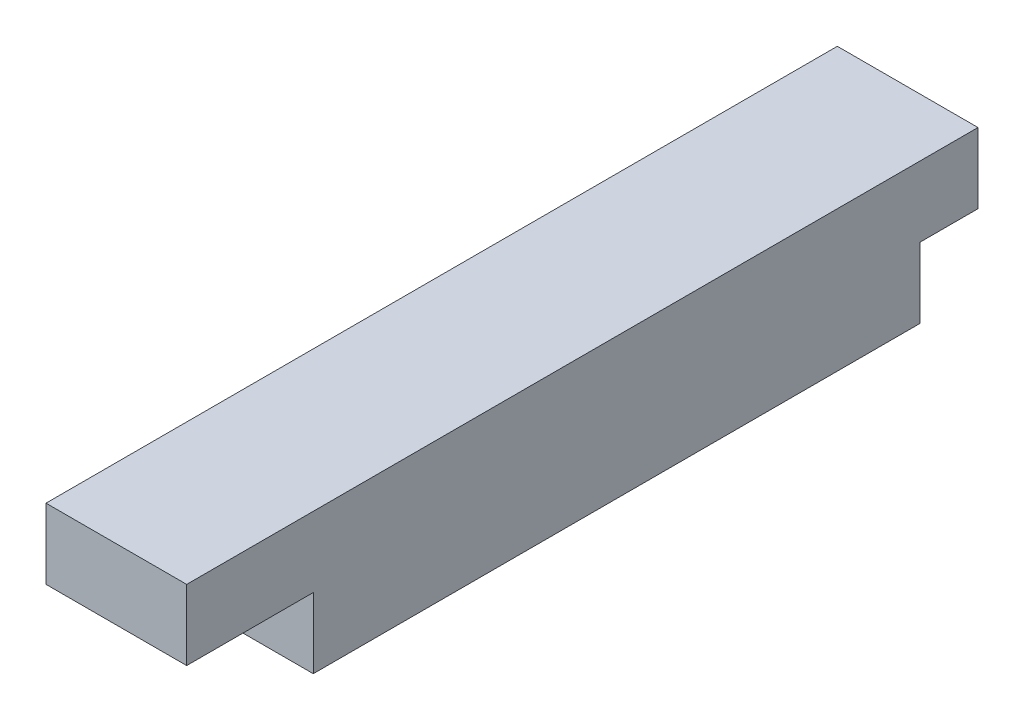
ISO-10303-21;
HEADER;
FILE_DESCRIPTION(('STEP AP214'),'2;1');
FILE_NAME('part.step','',(''),(''),'','','');
FILE_SCHEMA(('AUTOMOTIVE_DESIGN { 1 0 10303 214 1 1 1 1 }'));
ENDSEC;
DATA;
#1=APPLICATION_CONTEXT('core data for automotive mechanical design processes');
#2=APPLICATION_PROTOCOL_DEFINITION('international standard','automotive_design',2000,#1);
#3=PRODUCT_CONTEXT('',#1,'mechanical');
#4=PRODUCT('Part','Part','',(#3));
#5=PRODUCT_RELATED_PRODUCT_CATEGORY('part','',(#4));
#6=PRODUCT_DEFINITION_FORMATION('','',#4);
#7=PRODUCT_DEFINITION_CONTEXT('part definition',#1,'design');
#8=PRODUCT_DEFINITION('design','',#6,#7);
#9=PRODUCT_DEFINITION_SHAPE('','',#8);
#10=(LENGTH_UNIT() NAMED_UNIT(*) SI_UNIT(.MILLI.,.METRE.));
#11=(NAMED_UNIT(*) PLANE_ANGLE_UNIT() SI_UNIT($,.RADIAN.));
#12=(NAMED_UNIT(*) SI_UNIT($,.STERADIAN.) SOLID_ANGLE_UNIT());
#13=UNCERTAINTY_MEASURE_WITH_UNIT(LENGTH_MEASURE(1.E-05),#10,'distance_accuracy_value','');
#14=(GEOMETRIC_REPRESENTATION_CONTEXT(3) GLOBAL_UNCERTAINTY_ASSIGNED_CONTEXT((#13)) GLOBAL_UNIT_ASSIGNED_CONTEXT((#10,
#11,#12)) REPRESENTATION_CONTEXT('',''));
#15=CARTESIAN_POINT('',(0.,0.,0.));
#16=DIRECTION('',(0.,0.,1.));
#17=DIRECTION('',(1.,0.,0.));
#18=AXIS2_PLACEMENT_3D('',#15,#16,#17);
#19=CARTESIAN_POINT('',(0.,4.,0.));
#20=DIRECTION('',(1.,0.,0.));
#21=DIRECTION('',(0.,0.,-1.));
#22=AXIS2_PLACEMENT_3D('',#19,#20,#21);
#23=PLANE('',#22);
#24=DIRECTION('',(0.,0.,1.));
#25=VECTOR('',#24,1.);
#26=CARTESIAN_POINT('',(0.,0.,0.));
#27=LINE('',#26,#25);
#28=CARTESIAN_POINT('',(0.,0.,-45.));
#29=VERTEX_POINT('',#28);
#30=CARTESIAN_POINT('',(0.,0.,0.));
#31=VERTEX_POINT('',#30);
#32=EDGE_CURVE('E125',#29,#31,#27,.T.);
#33=ORIENTED_EDGE('',*,*,#32,.T.);
#34=DIRECTION('',(0.,-1.,0.));
#35=VECTOR('',#34,1.);
#36=CARTESIAN_POINT('',(0.,4.,0.));
#37=LINE('',#36,#35);
#38=CARTESIAN_POINT('',(0.,4.,0.));
#39=VERTEX_POINT('',#38);
#40=EDGE_CURVE('E11',#39,#31,#37,.T.);
#41=ORIENTED_EDGE('',*,*,#40,.F.);
#42=DIRECTION('',(0.,0.,1.));
#43=VECTOR('',#42,1.);
#44=CARTESIAN_POINT('',(0.,4.,0.));
#45=LINE('',#44,#43);
#46=CARTESIAN_POINT('',(0.,4.,-45.));
#47=VERTEX_POINT('',#46);
#48=EDGE_CURVE('E147',#47,#39,#45,.T.);
#49=ORIENTED_EDGE('',*,*,#48,.F.);
#50=DIRECTION('',(0.,-1.,0.));
#51=VECTOR('',#50,1.);
#52=CARTESIAN_POINT('',(0.,4.,-45.));
#53=LINE('',#52,#51);
#54=EDGE_CURVE('E156',#47,#29,#53,.T.);
#55=ORIENTED_EDGE('',*,*,#54,.T.);
#56=EDGE_LOOP('',(#33,#41,#49,#55));
#57=FACE_BOUND('',#56,.T.);
#58=ADVANCED_FACE('F35',(#57),#23,.F.);
#59=CARTESIAN_POINT('',(0.,4.,0.));
#60=DIRECTION('',(0.,0.,-1.));
#61=DIRECTION('',(-1.,0.,0.));
#62=AXIS2_PLACEMENT_3D('',#59,#60,#61);
#63=PLANE('',#62);
#64=DIRECTION('',(1.,0.,0.));
#65=VECTOR('',#64,1.);
#66=CARTESIAN_POINT('',(0.,0.,0.));
#67=LINE('',#66,#65);
#68=CARTESIAN_POINT('',(8.,0.,0.));
#69=VERTEX_POINT('',#68);
#70=EDGE_CURVE('E128',#31,#69,#67,.T.);
#71=ORIENTED_EDGE('',*,*,#70,.T.);
#72=DIRECTION('',(0.,-1.,0.));
#73=VECTOR('',#72,1.);
#74=CARTESIAN_POINT('',(8.,4.,0.));
#75=LINE('',#74,#73);
#76=CARTESIAN_POINT('',(8.,4.,0.));
#77=VERTEX_POINT('',#76);
#78=EDGE_CURVE('E43',#77,#69,#75,.T.);
#79=ORIENTED_EDGE('',*,*,#78,.F.);
#80=DIRECTION('',(1.,0.,0.));
#81=VECTOR('',#80,1.);
#82=CARTESIAN_POINT('',(0.,4.,0.));
#83=LINE('',#82,#81);
#84=EDGE_CURVE('E150',#39,#77,#83,.T.);
#85=ORIENTED_EDGE('',*,*,#84,.F.);
#86=ORIENTED_EDGE('',*,*,#40,.T.);
#87=EDGE_LOOP('',(#71,#79,#85,#86));
#88=FACE_BOUND('',#87,.T.);
#89=ADVANCED_FACE('F180',(#88),#63,.F.);
#90=CARTESIAN_POINT('',(8.,4.,0.));
#91=DIRECTION('',(-1.,0.,0.));
#92=DIRECTION('',(0.,0.,1.));
#93=AXIS2_PLACEMENT_3D('',#90,#91,#92);
#94=PLANE('',#93);
#95=DIRECTION('',(0.,0.,-1.));
#96=VECTOR('',#95,1.);
#97=CARTESIAN_POINT('',(8.,0.,0.));
#98=LINE('',#97,#96);
#99=CARTESIAN_POINT('',(8.,0.,-7.2));
#100=VERTEX_POINT('',#99);
#101=EDGE_CURVE('E124',#69,#100,#98,.T.);
#102=ORIENTED_EDGE('',*,*,#101,.T.);
#103=DIRECTION('',(0.,1.,0.));
#104=VECTOR('',#103,1.);
#105=CARTESIAN_POINT('',(8.,-4.,-7.2));
#106=LINE('',#105,#104);
#107=CARTESIAN_POINT('',(8.,-4.,-7.2));
#108=VERTEX_POINT('',#107);
#109=EDGE_CURVE('E104',#108,#100,#106,.T.);
#110=ORIENTED_EDGE('',*,*,#109,.F.);
#111=DIRECTION('',(0.,0.,1.));
#112=VECTOR('',#111,1.);
#113=CARTESIAN_POINT('',(8.,-4.,-41.7));
#114=LINE('',#113,#112);
#115=CARTESIAN_POINT('',(8.,-4.,-41.7));
#116=VERTEX_POINT('',#115);
#117=EDGE_CURVE('E110',#116,#108,#114,.T.);
#118=ORIENTED_EDGE('',*,*,#117,.F.);
#119=DIRECTION('',(0.,1.,0.));
#120=VECTOR('',#119,1.);
#121=CARTESIAN_POINT('',(8.,-4.,-41.7));
#122=LINE('',#121,#120);
#123=CARTESIAN_POINT('',(8.,0.,-41.7));
#124=VERTEX_POINT('',#123);
#125=EDGE_CURVE('E140',#116,#124,#122,.T.);
#126=ORIENTED_EDGE('',*,*,#125,.T.);
#127=CARTESIAN_POINT('',(8.,0.,-45.));
#128=VERTEX_POINT('',#127);
#129=EDGE_CURVE('E56',#124,#128,#98,.T.);
#130=ORIENTED_EDGE('',*,*,#129,.T.);
#131=DIRECTION('',(0.,-1.,0.));
#132=VECTOR('',#131,1.);
#133=CARTESIAN_POINT('',(8.,4.,-45.));
#134=LINE('',#133,#132);
#135=CARTESIAN_POINT('',(8.,4.,-45.));
#136=VERTEX_POINT('',#135);
#137=EDGE_CURVE('E167',#136,#128,#134,.T.);
#138=ORIENTED_EDGE('',*,*,#137,.F.);
#139=DIRECTION('',(0.,0.,-1.));
#140=VECTOR('',#139,1.);
#141=CARTESIAN_POINT('',(8.,4.,0.));
#142=LINE('',#141,#140);
#143=EDGE_CURVE('E153',#77,#136,#142,.T.);
#144=ORIENTED_EDGE('',*,*,#143,.F.);
#145=ORIENTED_EDGE('',*,*,#78,.T.);
#146=EDGE_LOOP('',(#102,#110,#118,#126,#130,#138,#144,#145));
#147=FACE_BOUND('',#146,.T.);
#148=ADVANCED_FACE('F121',(#147),#94,.F.);
#149=CARTESIAN_POINT('',(0.,4.,-45.));
#150=DIRECTION('',(0.,0.,1.));
#151=DIRECTION('',(1.,0.,0.));
#152=AXIS2_PLACEMENT_3D('',#149,#150,#151);
#153=PLANE('',#152);
#154=DIRECTION('',(-1.,0.,0.));
#155=VECTOR('',#154,1.);
#156=CARTESIAN_POINT('',(0.,0.,-45.));
#157=LINE('',#156,#155);
#158=EDGE_CURVE('E151',#128,#29,#157,.T.);
#159=ORIENTED_EDGE('',*,*,#158,.T.);
#160=ORIENTED_EDGE('',*,*,#54,.F.);
#161=DIRECTION('',(-1.,0.,0.));
#162=VECTOR('',#161,1.);
#163=CARTESIAN_POINT('',(0.,4.,-45.));
#164=LINE('',#163,#162);
#165=EDGE_CURVE('E155',#136,#47,#164,.T.);
#166=ORIENTED_EDGE('',*,*,#165,.F.);
#167=ORIENTED_EDGE('',*,*,#137,.T.);
#168=EDGE_LOOP('',(#159,#160,#166,#167));
#169=FACE_BOUND('',#168,.T.);
#170=ADVANCED_FACE('F185',(#169),#153,.F.);
#171=CARTESIAN_POINT('',(0.,4.,0.));
#172=DIRECTION('',(0.,-1.,0.));
#173=DIRECTION('',(0.,0.,-1.));
#174=AXIS2_PLACEMENT_3D('',#171,#172,#173);
#175=PLANE('',#174);
#176=ORIENTED_EDGE('',*,*,#48,.T.);
#177=ORIENTED_EDGE('',*,*,#84,.T.);
#178=ORIENTED_EDGE('',*,*,#143,.T.);
#179=ORIENTED_EDGE('',*,*,#165,.T.);
#180=EDGE_LOOP('',(#176,#177,#178,#179));
#181=FACE_BOUND('',#180,.T.);
#182=ADVANCED_FACE('F183',(#181),#175,.F.);
#183=CARTESIAN_POINT('',(0.,0.,0.));
#184=DIRECTION('',(0.,-1.,0.));
#185=DIRECTION('',(0.,0.,-1.));
#186=AXIS2_PLACEMENT_3D('',#183,#184,#185);
#187=PLANE('',#186);
#188=DIRECTION('',(1.,0.,0.));
#189=VECTOR('',#188,1.);
#190=CARTESIAN_POINT('',(8.,0.,-41.7));
#191=LINE('',#190,#189);
#192=CARTESIAN_POINT('',(3.,0.,-41.7));
#193=VERTEX_POINT('',#192);
#194=EDGE_CURVE('E51',#193,#124,#191,.T.);
#195=ORIENTED_EDGE('',*,*,#194,.F.);
#196=DIRECTION('',(0.,0.,-1.));
#197=VECTOR('',#196,1.);
#198=CARTESIAN_POINT('',(3.,0.,-41.7));
#199=LINE('',#198,#197);
#200=CARTESIAN_POINT('',(3.,0.,-7.2));
#201=VERTEX_POINT('',#200);
#202=EDGE_CURVE('E139',#201,#193,#199,.T.);
#203=ORIENTED_EDGE('',*,*,#202,.F.);
#204=DIRECTION('',(-1.,0.,0.));
#205=VECTOR('',#204,1.);
#206=CARTESIAN_POINT('',(8.,0.,-7.2));
#207=LINE('',#206,#205);
#208=EDGE_CURVE('E273',#100,#201,#207,.T.);
#209=ORIENTED_EDGE('',*,*,#208,.F.);
#210=ORIENTED_EDGE('',*,*,#101,.F.);
#211=ORIENTED_EDGE('',*,*,#70,.F.);
#212=ORIENTED_EDGE('',*,*,#32,.F.);
#213=ORIENTED_EDGE('',*,*,#158,.F.);
#214=ORIENTED_EDGE('',*,*,#129,.F.);
#215=EDGE_LOOP('',(#195,#203,#209,#210,#211,#212,#213,#214));
#216=FACE_BOUND('',#215,.T.);
#217=ADVANCED_FACE('F177',(#216),#187,.T.);
#218=CARTESIAN_POINT('',(8.,-4.,-7.2));
#219=DIRECTION('',(0.,0.,-1.));
#220=DIRECTION('',(-1.,0.,0.));
#221=AXIS2_PLACEMENT_3D('',#218,#219,#220);
#222=PLANE('',#221);
#223=ORIENTED_EDGE('',*,*,#208,.T.);
#224=DIRECTION('',(0.,1.,0.));
#225=VECTOR('',#224,1.);
#226=CARTESIAN_POINT('',(3.,-4.,-7.2));
#227=LINE('',#226,#225);
#228=CARTESIAN_POINT('',(3.,-4.,-7.2));
#229=VERTEX_POINT('',#228);
#230=EDGE_CURVE('E106',#229,#201,#227,.T.);
#231=ORIENTED_EDGE('',*,*,#230,.F.);
#232=DIRECTION('',(-1.,0.,0.));
#233=VECTOR('',#232,1.);
#234=CARTESIAN_POINT('',(8.,-4.,-7.2));
#235=LINE('',#234,#233);
#236=EDGE_CURVE('E99',#108,#229,#235,.T.);
#237=ORIENTED_EDGE('',*,*,#236,.F.);
#238=ORIENTED_EDGE('',*,*,#109,.T.);
#239=EDGE_LOOP('',(#223,#231,#237,#238));
#240=FACE_BOUND('',#239,.T.);
#241=ADVANCED_FACE('F102',(#240),#222,.F.);
#242=CARTESIAN_POINT('',(3.,-4.,-41.7));
#243=DIRECTION('',(1.,0.,0.));
#244=DIRECTION('',(0.,0.,-1.));
#245=AXIS2_PLACEMENT_3D('',#242,#243,#244);
#246=PLANE('',#245);
#247=ORIENTED_EDGE('',*,*,#202,.T.);
#248=DIRECTION('',(0.,1.,0.));
#249=VECTOR('',#248,1.);
#250=CARTESIAN_POINT('',(3.,-4.,-41.7));
#251=LINE('',#250,#249);
#252=CARTESIAN_POINT('',(3.,-4.,-41.7));
#253=VERTEX_POINT('',#252);
#254=EDGE_CURVE('E130',#253,#193,#251,.T.);
#255=ORIENTED_EDGE('',*,*,#254,.F.);
#256=DIRECTION('',(0.,0.,-1.));
#257=VECTOR('',#256,1.);
#258=CARTESIAN_POINT('',(3.,-4.,-41.7));
#259=LINE('',#258,#257);
#260=EDGE_CURVE('E109',#229,#253,#259,.T.);
#261=ORIENTED_EDGE('',*,*,#260,.F.);
#262=ORIENTED_EDGE('',*,*,#230,.T.);
#263=EDGE_LOOP('',(#247,#255,#261,#262));
#264=FACE_BOUND('',#263,.T.);
#265=ADVANCED_FACE('F190',(#264),#246,.F.);
#266=CARTESIAN_POINT('',(8.,-4.,-41.7));
#267=DIRECTION('',(0.,0.,1.));
#268=DIRECTION('',(1.,0.,0.));
#269=AXIS2_PLACEMENT_3D('',#266,#267,#268);
#270=PLANE('',#269);
#271=ORIENTED_EDGE('',*,*,#194,.T.);
#272=ORIENTED_EDGE('',*,*,#125,.F.);
#273=DIRECTION('',(1.,0.,0.));
#274=VECTOR('',#273,1.);
#275=CARTESIAN_POINT('',(8.,-4.,-41.7));
#276=LINE('',#275,#274);
#277=EDGE_CURVE('E115',#253,#116,#276,.T.);
#278=ORIENTED_EDGE('',*,*,#277,.F.);
#279=ORIENTED_EDGE('',*,*,#254,.T.);
#280=EDGE_LOOP('',(#271,#272,#278,#279));
#281=FACE_BOUND('',#280,.T.);
#282=ADVANCED_FACE('F191',(#281),#270,.F.);
#283=CARTESIAN_POINT('',(0.,-4.,0.));
#284=DIRECTION('',(0.,-1.,0.));
#285=DIRECTION('',(0.,0.,-1.));
#286=AXIS2_PLACEMENT_3D('',#283,#284,#285);
#287=PLANE('',#286);
#288=ORIENTED_EDGE('',*,*,#117,.T.);
#289=ORIENTED_EDGE('',*,*,#236,.T.);
#290=ORIENTED_EDGE('',*,*,#260,.T.);
#291=ORIENTED_EDGE('',*,*,#277,.T.);
#292=EDGE_LOOP('',(#288,#289,#290,#291));
#293=FACE_BOUND('',#292,.T.);
#294=ADVANCED_FACE('F113',(#293),#287,.T.);
#295=CLOSED_SHELL('',(#58,#89,#148,#170,#182,#217,#241,#265,#282,#294));
#296=MANIFOLD_SOLID_BREP('B2',#295);
#297=ADVANCED_BREP_SHAPE_REPRESENTATION('',(#18,#296),#14);
#298=SHAPE_DEFINITION_REPRESENTATION(#9,#297);
ENDSEC;
END-ISO-10303-21;
